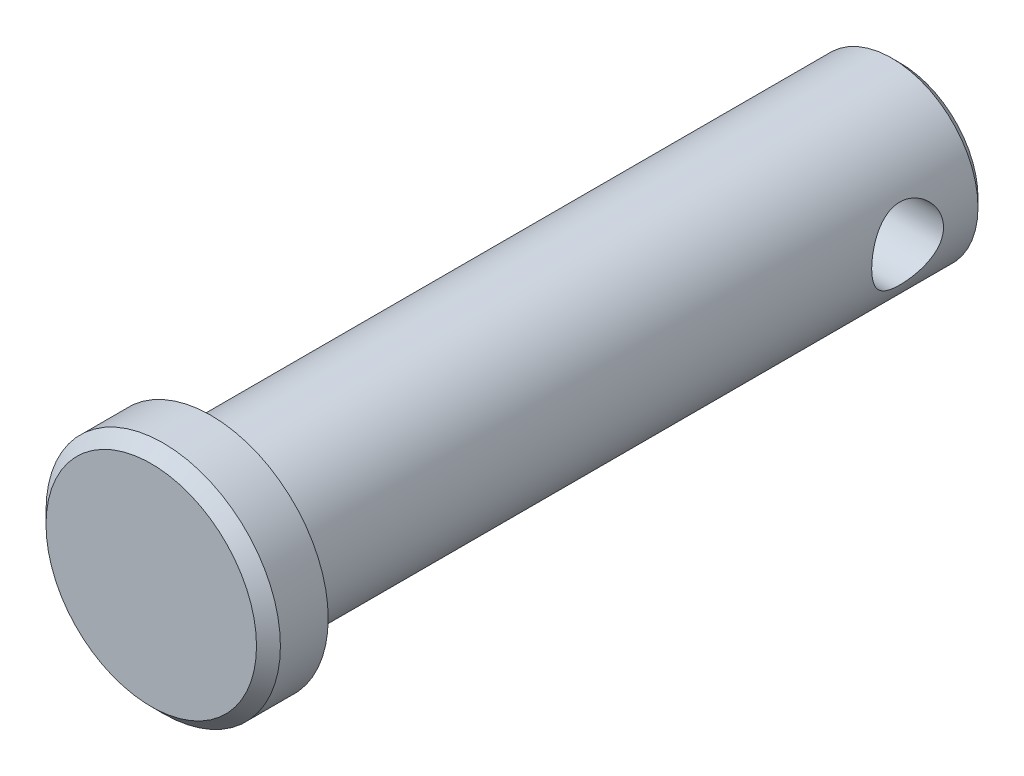
ISO-10303-21;
HEADER;
FILE_DESCRIPTION(('STEP AP214'),'2;1');
FILE_NAME('part.step','',(''),(''),'','','');
FILE_SCHEMA(('AUTOMOTIVE_DESIGN { 1 0 10303 214 1 1 1 1 }'));
ENDSEC;
DATA;
#1=APPLICATION_CONTEXT('core data for automotive mechanical design processes');
#2=APPLICATION_PROTOCOL_DEFINITION('international standard','automotive_design',2000,#1);
#3=PRODUCT_CONTEXT('',#1,'mechanical');
#4=PRODUCT('Part','Part','',(#3));
#5=PRODUCT_RELATED_PRODUCT_CATEGORY('part','',(#4));
#6=PRODUCT_DEFINITION_FORMATION('','',#4);
#7=PRODUCT_DEFINITION_CONTEXT('part definition',#1,'design');
#8=PRODUCT_DEFINITION('design','',#6,#7);
#9=PRODUCT_DEFINITION_SHAPE('','',#8);
#10=(LENGTH_UNIT() NAMED_UNIT(*) SI_UNIT(.MILLI.,.METRE.));
#11=(NAMED_UNIT(*) PLANE_ANGLE_UNIT() SI_UNIT($,.RADIAN.));
#12=(NAMED_UNIT(*) SI_UNIT($,.STERADIAN.) SOLID_ANGLE_UNIT());
#13=UNCERTAINTY_MEASURE_WITH_UNIT(LENGTH_MEASURE(1.E-05),#10,'distance_accuracy_value','');
#14=(GEOMETRIC_REPRESENTATION_CONTEXT(3) GLOBAL_UNCERTAINTY_ASSIGNED_CONTEXT((#13)) GLOBAL_UNIT_ASSIGNED_CONTEXT((#10,
#11,#12)) REPRESENTATION_CONTEXT('',''));
#15=CARTESIAN_POINT('',(0.,0.,0.));
#16=DIRECTION('',(0.,0.,1.));
#17=DIRECTION('',(1.,0.,0.));
#18=AXIS2_PLACEMENT_3D('',#15,#16,#17);
#19=CARTESIAN_POINT('',(0.,0.,19.05));
#20=DIRECTION('',(0.,0.,-1.));
#21=DIRECTION('',(-1.,0.,0.));
#22=AXIS2_PLACEMENT_3D('',#19,#20,#21);
#23=CYLINDRICAL_SURFACE('',#22,4.7625);
#24=CARTESIAN_POINT('',(0.,0.,-18.57375));
#25=DIRECTION('',(0.,0.,1.));
#26=DIRECTION('',(1.,0.,0.));
#27=AXIS2_PLACEMENT_3D('',#24,#25,#26);
#28=CIRCLE('',#27,4.7625);
#29=CARTESIAN_POINT('',(4.7625,0.,-18.57375));
#30=VERTEX_POINT('',#29);
#31=EDGE_CURVE('E41',#30,#30,#28,.T.);
#32=ORIENTED_EDGE('',*,*,#31,.T.);
#33=EDGE_LOOP('',(#32));
#34=FACE_BOUND('',#33,.T.);
#35=CARTESIAN_POINT('',(-4.7625,0.,-12.7));
#36=CARTESIAN_POINT('',(-4.76249140158045,-0.106295908560072,-12.7000114380824));
#37=CARTESIAN_POINT('',(-4.75890007347352,-0.212758967838845,-12.7085914841634));
#38=CARTESIAN_POINT('',(-4.74488118807538,-0.422667701710698,-12.7426070155608));
#39=CARTESIAN_POINT('',(-4.73443579242881,-0.526104765072406,-12.768086485087));
#40=CARTESIAN_POINT('',(-4.70783108848027,-0.726580864674275,-12.8347963582017));
#41=CARTESIAN_POINT('',(-4.69169114960318,-0.8236402825267,-12.8759734057807));
#42=CARTESIAN_POINT('',(-4.65526892272179,-1.00937973872918,-12.9726893568817));
#43=CARTESIAN_POINT('',(-4.63498788984898,-1.0980623041503,-13.0282239101163));
#44=CARTESIAN_POINT('',(-4.59117427508592,-1.26912434065072,-13.155023509863));
#45=CARTESIAN_POINT('',(-4.56753520905172,-1.35102801218445,-13.2268933277037));
#46=CARTESIAN_POINT('',(-4.52013183583765,-1.50202871598238,-13.3830446314673));
#47=CARTESIAN_POINT('',(-4.4963674694456,-1.57111900525552,-13.46733261077));
#48=CARTESIAN_POINT('',(-4.4500962212813,-1.69789058594091,-13.6509550093843));
#49=CARTESIAN_POINT('',(-4.42770874161498,-1.75484326694356,-13.7508256993771));
#50=CARTESIAN_POINT('',(-4.38841471116746,-1.85092880684824,-13.9597975469495));
#51=CARTESIAN_POINT('',(-4.37150533813807,-1.89007084577611,-14.0688939149316));
#52=CARTESIAN_POINT('',(-4.34623456677981,-1.94745924820552,-14.2877439856816));
#53=CARTESIAN_POINT('',(-4.33750065397212,-1.96662131880699,-14.397212892385));
#54=CARTESIAN_POINT('',(-4.32849855373462,-1.98636270823876,-14.6181338521399));
#55=CARTESIAN_POINT('',(-4.328225697501,-1.98695227536355,-14.7295847775409));
#56=CARTESIAN_POINT('',(-4.33586127302854,-1.97022164952332,-14.9421850959405));
#57=CARTESIAN_POINT('',(-4.34314413823751,-1.95427093765777,-15.0434692407961));
#58=CARTESIAN_POINT('',(-4.36401341403402,-1.90720965737545,-15.2417654444631));
#59=CARTESIAN_POINT('',(-4.37760103179407,-1.87609618568393,-15.3387766812432));
#60=CARTESIAN_POINT('',(-4.40985568326751,-1.79898609480019,-15.5282228534989));
#61=CARTESIAN_POINT('',(-4.42862465094254,-1.75268686068537,-15.6205164807));
#62=CARTESIAN_POINT('',(-4.46910350686474,-1.64673347596642,-15.7963834025347));
#63=CARTESIAN_POINT('',(-4.49081455356025,-1.58707405869977,-15.879953239099));
#64=CARTESIAN_POINT('',(-4.53696350793792,-1.45017484530084,-16.0434336844884));
#65=CARTESIAN_POINT('',(-4.561476802296,-1.37187540459195,-16.1224381757244));
#66=CARTESIAN_POINT('',(-4.6089200606614,-1.20289572579427,-16.2664989359477));
#67=CARTESIAN_POINT('',(-4.63184965292253,-1.11221259562442,-16.3315519375613));
#68=CARTESIAN_POINT('',(-4.67420775145901,-0.918286118550734,-16.4471918699908));
#69=CARTESIAN_POINT('',(-4.69354323137542,-0.814801174635692,-16.4974102441767));
#70=CARTESIAN_POINT('',(-4.72582051746,-0.599840689011346,-16.5794073091202));
#71=CARTESIAN_POINT('',(-4.73876585655208,-0.488369601737119,-16.6111961907108));
#72=CARTESIAN_POINT('',(-4.75614430383386,-0.268173379937138,-16.653535387501));
#73=CARTESIAN_POINT('',(-4.76106396412311,-0.159720415379841,-16.6653017236919));
#74=CARTESIAN_POINT('',(-4.76338979960382,0.0577130156000396,-16.6708871299874));
#75=CARTESIAN_POINT('',(-4.76079813192703,0.166693321604807,-16.664711352775));
#76=CARTESIAN_POINT('',(-4.74870808030392,0.376393459717026,-16.6354584028704));
#77=CARTESIAN_POINT('',(-4.73955883563333,0.477254834540024,-16.6132351978707));
#78=CARTESIAN_POINT('',(-4.71564663251208,0.673707613991605,-16.5537067411665));
#79=CARTESIAN_POINT('',(-4.7008829648603,0.769298351097896,-16.5163995840539));
#80=CARTESIAN_POINT('',(-4.666587546492,0.955848037292252,-16.426543576057));
#81=CARTESIAN_POINT('',(-4.64692192707484,1.04657086350783,-16.3735572592557));
#82=CARTESIAN_POINT('',(-4.60492164769306,1.21816211826739,-16.2543277627557));
#83=CARTESIAN_POINT('',(-4.58258587495364,1.29902640975558,-16.1880790481973));
#84=CARTESIAN_POINT('',(-4.53567939534007,1.45467932056039,-16.03866611718));
#85=CARTESIAN_POINT('',(-4.51106304400759,1.52862073304299,-15.9546313765093));
#86=CARTESIAN_POINT('',(-4.46380134619208,1.66158838069249,-15.7749537244526));
#87=CARTESIAN_POINT('',(-4.44115644808334,1.72061122865917,-15.6793081841649));
#88=CARTESIAN_POINT('',(-4.40025450662331,1.8227033683131,-15.4771499967072));
#89=CARTESIAN_POINT('',(-4.3820645555624,1.86553345201759,-15.3705019686202));
#90=CARTESIAN_POINT('',(-4.35305764608595,1.93226394648122,-15.1505116823265));
#91=CARTESIAN_POINT('',(-4.34223460919757,1.95617996596104,-15.0371750270577));
#92=CARTESIAN_POINT('',(-4.33011523702907,1.98285227553879,-14.8164253150213));
#93=CARTESIAN_POINT('',(-4.32814969660371,1.98709566405842,-14.7092278486105));
#94=CARTESIAN_POINT('',(-4.33218991655001,1.9782722614421,-14.4957119579385));
#95=CARTESIAN_POINT('',(-4.33819445320237,1.96520812768995,-14.389393401252));
#96=CARTESIAN_POINT('',(-4.3568866269235,1.92338967589029,-14.1857527633931));
#97=CARTESIAN_POINT('',(-4.36925013318788,1.89539409419702,-14.0882422808769));
#98=CARTESIAN_POINT('',(-4.39901300153713,1.82524921020888,-13.8992800160954));
#99=CARTESIAN_POINT('',(-4.41641377846563,1.78309593083637,-13.8078299449294));
#100=CARTESIAN_POINT('',(-4.45558790364021,1.68291328922589,-13.6275827651808));
#101=CARTESIAN_POINT('',(-4.47756125557966,1.62408172945392,-13.5392758008578));
#102=CARTESIAN_POINT('',(-4.5228460637297,1.49333596530074,-13.3733220287649));
#103=CARTESIAN_POINT('',(-4.54615798199076,1.42141722463767,-13.2956789337341));
#104=CARTESIAN_POINT('',(-4.59353273649544,1.26031949767388,-13.1474389678255));
#105=CARTESIAN_POINT('',(-4.61752660299969,1.17026489966908,-13.0777671628655));
#106=CARTESIAN_POINT('',(-4.66185477999957,0.97885262581445,-12.9544771174995));
#107=CARTESIAN_POINT('',(-4.68218742117825,0.877489827988868,-12.9008661926128));
#108=CARTESIAN_POINT('',(-4.71660828587906,0.667912140039744,-12.8123793703642));
#109=CARTESIAN_POINT('',(-4.73079417348867,0.559838210681758,-12.777208432995));
#110=CARTESIAN_POINT('',(-4.75172103007692,0.338789044681411,-12.7258662025889));
#111=CARTESIAN_POINT('',(-4.75848530476497,0.225830315707269,-12.7096354224838));
#112=CARTESIAN_POINT('',(-4.76206006515682,0.0749872800467031,-12.7010586067753));
#113=CARTESIAN_POINT('',(-4.76250303375275,0.0375040440476054,-12.6999959643381));
#114=CARTESIAN_POINT('',(-4.7625,0.,-12.7));
#115=B_SPLINE_CURVE_WITH_KNOTS('',3,(#35,#36,#37,#38,#39,#40,#41,#42,#43,#44,#45,#46,#47,#48,
#49,#50,#51,#52,#53,#54,#55,#56,#57,#58,#59,#60,#61,#62,#63,#64,#65,#66,#67,#68,#69,#70,#71,#72,
#73,#74,#75,#76,#77,#78,#79,#80,#81,#82,#83,#84,#85,#86,#87,#88,#89,#90,#91,#92,#93,#94,#95,#96,
#97,#98,#99,#100,#101,#102,#103,#104,#105,#106,#107,#108,#109,#110,#111,#112,#113,#114),
.UNSPECIFIED.,.T.,.F.,(4,2,2,2,2,2,2,2,2,2,2,2,2,2,2,2,2,2,2,2,2,2,2,2,2,2,2,2,2,2,2,2,2,2,2,2,
2,2,2,4),(0.,0.31878098372825,0.638394933248055,0.956932064901252,1.27537279350409,
1.60842223858481,1.94164645533701,2.29126612705861,2.64070539184808,2.97331246105872,
3.3057359947036,3.61267624559058,3.91967529066949,4.23320706980709,4.54686266326064,
4.88702574040535,5.22726839536908,5.5753643740904,5.92326768446545,6.24916903886785,
6.57497680895409,6.88461586205456,7.19429404105333,7.51359202244554,7.83302353682823,
8.17528349746503,8.5176210971904,8.86483476520742,9.21176159730895,9.53198305625932,
9.85215535434837,10.1574226931906,10.462775857341,10.7864893076844,11.1103151781368,
11.4577262432026,11.8052953096787,12.1471190861327,12.4878663512005,12.6003408219232),.UNSPECIFIED.);
#116=CARTESIAN_POINT('',(-4.7625,0.,-12.7));
#117=VERTEX_POINT('',#116);
#118=EDGE_CURVE('E55',#117,#117,#115,.T.);
#119=ORIENTED_EDGE('',*,*,#118,.T.);
#120=EDGE_LOOP('',(#119));
#121=FACE_BOUND('',#120,.T.);
#122=CARTESIAN_POINT('',(4.7625,0.,-16.66875));
#123=CARTESIAN_POINT('',(4.76249140158046,-0.106295908560073,-16.6687385619176));
#124=CARTESIAN_POINT('',(4.75890007347352,-0.212758967838847,-16.6601585158366));
#125=CARTESIAN_POINT('',(4.74488118807538,-0.4226677017107,-16.6261429844392));
#126=CARTESIAN_POINT('',(4.73443579242881,-0.526104765072408,-16.600663514913));
#127=CARTESIAN_POINT('',(4.70783108848027,-0.726580864674275,-16.5339536417983));
#128=CARTESIAN_POINT('',(4.69169114960318,-0.823640282526699,-16.4927765942193));
#129=CARTESIAN_POINT('',(4.65526892272179,-1.00937973872918,-16.3960606431183));
#130=CARTESIAN_POINT('',(4.63498788984898,-1.0980623041503,-16.3405260898837));
#131=CARTESIAN_POINT('',(4.59117427508592,-1.26912434065072,-16.213726490137));
#132=CARTESIAN_POINT('',(4.56753520905172,-1.35102801218446,-16.1418566722963));
#133=CARTESIAN_POINT('',(4.52013183583765,-1.50202871598238,-15.9857053685327));
#134=CARTESIAN_POINT('',(4.4963674694456,-1.57111900525552,-15.90141738923));
#135=CARTESIAN_POINT('',(4.4500962212813,-1.69789058594091,-15.7177949906157));
#136=CARTESIAN_POINT('',(4.42770874161498,-1.75484326694356,-15.6179243006229));
#137=CARTESIAN_POINT('',(4.38841471116746,-1.85092880684824,-15.4089524530505));
#138=CARTESIAN_POINT('',(4.37150533813807,-1.89007084577611,-15.2998560850684));
#139=CARTESIAN_POINT('',(4.34623456677981,-1.94745924820552,-15.0810060143184));
#140=CARTESIAN_POINT('',(4.33750065397212,-1.96662131880699,-14.971537107615));
#141=CARTESIAN_POINT('',(4.32849855373462,-1.98636270823876,-14.7506161478601));
#142=CARTESIAN_POINT('',(4.328225697501,-1.98695227536355,-14.6391652224591));
#143=CARTESIAN_POINT('',(4.33586127302854,-1.97022164952332,-14.4265649040595));
#144=CARTESIAN_POINT('',(4.34314413823751,-1.95427093765777,-14.3252807592039));
#145=CARTESIAN_POINT('',(4.36401341403402,-1.90720965737545,-14.1269845555369));
#146=CARTESIAN_POINT('',(4.37760103179407,-1.87609618568393,-14.0299733187568));
#147=CARTESIAN_POINT('',(4.40985568326751,-1.79898609480019,-13.8405271465011));
#148=CARTESIAN_POINT('',(4.42862465094254,-1.75268686068537,-13.7482335193));
#149=CARTESIAN_POINT('',(4.46910350686474,-1.64673347596643,-13.5723665974653));
#150=CARTESIAN_POINT('',(4.49081455356025,-1.58707405869977,-13.488796760901));
#151=CARTESIAN_POINT('',(4.53696350793792,-1.45017484530084,-13.3253163155116));
#152=CARTESIAN_POINT('',(4.561476802296,-1.37187540459195,-13.2463118242756));
#153=CARTESIAN_POINT('',(4.6089200606614,-1.20289572579427,-13.1022510640523));
#154=CARTESIAN_POINT('',(4.63184965292253,-1.11221259562442,-13.0371980624387));
#155=CARTESIAN_POINT('',(4.67420775145901,-0.918286118550734,-12.9215581300092));
#156=CARTESIAN_POINT('',(4.69354323137542,-0.814801174635692,-12.8713397558233));
#157=CARTESIAN_POINT('',(4.72582051746,-0.599840689011345,-12.7893426908798));
#158=CARTESIAN_POINT('',(4.73876585655208,-0.488369601737118,-12.7575538092892));
#159=CARTESIAN_POINT('',(4.75614430383386,-0.268173379937137,-12.715214612499));
#160=CARTESIAN_POINT('',(4.76106396412311,-0.15972041537984,-12.7034482763081));
#161=CARTESIAN_POINT('',(4.76338979960382,0.0577130156000403,-12.6978628700126));
#162=CARTESIAN_POINT('',(4.76079813192703,0.166693321604808,-12.704038647225));
#163=CARTESIAN_POINT('',(4.74870808030392,0.376393459717027,-12.7332915971296));
#164=CARTESIAN_POINT('',(4.73955883563333,0.477254834540025,-12.7555148021293));
#165=CARTESIAN_POINT('',(4.71564663251208,0.673707613991605,-12.8150432588335));
#166=CARTESIAN_POINT('',(4.70088296486029,0.769298351097896,-12.8523504159461));
#167=CARTESIAN_POINT('',(4.666587546492,0.955848037292252,-12.942206423943));
#168=CARTESIAN_POINT('',(4.64692192707484,1.04657086350782,-12.9951927407443));
#169=CARTESIAN_POINT('',(4.60492164769306,1.21816211826739,-13.1144222372443));
#170=CARTESIAN_POINT('',(4.58258587495364,1.29902640975558,-13.1806709518027));
#171=CARTESIAN_POINT('',(4.53567939534007,1.45467932056039,-13.3300838828199));
#172=CARTESIAN_POINT('',(4.51106304400759,1.52862073304299,-13.4141186234907));
#173=CARTESIAN_POINT('',(4.46380134619208,1.66158838069249,-13.5937962755474));
#174=CARTESIAN_POINT('',(4.44115644808334,1.72061122865917,-13.6894418158351));
#175=CARTESIAN_POINT('',(4.40025450662331,1.8227033683131,-13.8916000032928));
#176=CARTESIAN_POINT('',(4.3820645555624,1.86553345201759,-13.9982480313798));
#177=CARTESIAN_POINT('',(4.35305764608594,1.93226394648122,-14.2182383176735));
#178=CARTESIAN_POINT('',(4.34223460919756,1.95617996596104,-14.3315749729423));
#179=CARTESIAN_POINT('',(4.33011523702907,1.98285227553879,-14.5523246849787));
#180=CARTESIAN_POINT('',(4.32814969660371,1.98709566405842,-14.6595221513895));
#181=CARTESIAN_POINT('',(4.33218991655001,1.9782722614421,-14.8730380420615));
#182=CARTESIAN_POINT('',(4.33819445320237,1.96520812768995,-14.979356598748));
#183=CARTESIAN_POINT('',(4.3568866269235,1.92338967589029,-15.1829972366069));
#184=CARTESIAN_POINT('',(4.36925013318788,1.89539409419702,-15.2805077191231));
#185=CARTESIAN_POINT('',(4.39901300153713,1.82524921020888,-15.4694699839046));
#186=CARTESIAN_POINT('',(4.41641377846563,1.78309593083637,-15.5609200550706));
#187=CARTESIAN_POINT('',(4.45558790364021,1.68291328922589,-15.7411672348192));
#188=CARTESIAN_POINT('',(4.47756125557966,1.62408172945392,-15.8294741991422));
#189=CARTESIAN_POINT('',(4.5228460637297,1.49333596530074,-15.9954279712351));
#190=CARTESIAN_POINT('',(4.54615798199076,1.42141722463767,-16.0730710662659));
#191=CARTESIAN_POINT('',(4.59353273649544,1.26031949767387,-16.2213110321745));
#192=CARTESIAN_POINT('',(4.61752660299969,1.17026489966908,-16.2909828371345));
#193=CARTESIAN_POINT('',(4.66185477999957,0.978852625814449,-16.4142728825005));
#194=CARTESIAN_POINT('',(4.68218742117825,0.877489827988868,-16.4678838073872));
#195=CARTESIAN_POINT('',(4.71660828587906,0.667912140039744,-16.5563706296358));
#196=CARTESIAN_POINT('',(4.73079417348868,0.559838210681757,-16.591541567005));
#197=CARTESIAN_POINT('',(4.75172103007692,0.33878904468141,-16.6428837974111));
#198=CARTESIAN_POINT('',(4.75848530476497,0.225830315707268,-16.6591145775162));
#199=CARTESIAN_POINT('',(4.76206006515682,0.0749872800467027,-16.6676913932247));
#200=CARTESIAN_POINT('',(4.76250303375276,0.0375040440476052,-16.6687540356619));
#201=CARTESIAN_POINT('',(4.7625,0.,-16.66875));
#202=B_SPLINE_CURVE_WITH_KNOTS('',3,(#122,#123,#124,#125,#126,#127,#128,#129,#130,#131,#132,
#133,#134,#135,#136,#137,#138,#139,#140,#141,#142,#143,#144,#145,#146,#147,#148,#149,#150,#151,
#152,#153,#154,#155,#156,#157,#158,#159,#160,#161,#162,#163,#164,#165,#166,#167,#168,#169,#170,
#171,#172,#173,#174,#175,#176,#177,#178,#179,#180,#181,#182,#183,#184,#185,#186,#187,#188,#189,
#190,#191,#192,#193,#194,#195,#196,#197,#198,#199,#200,#201),.UNSPECIFIED.,.T.,.F.,(4,2,2,2,2,2,
2,2,2,2,2,2,2,2,2,2,2,2,2,2,2,2,2,2,2,2,2,2,2,2,2,2,2,2,2,2,2,2,2,4),(0.,0.318780983728252,
0.638394933248055,0.956932064901251,1.27537279350409,1.60842223858481,1.94164645533701,
2.29126612705861,2.64070539184808,2.97331246105872,3.3057359947036,3.61267624559057,
3.91967529066949,4.23320706980708,4.54686266326064,4.88702574040535,5.22726839536907,
5.5753643740904,5.92326768446545,6.24916903886785,6.57497680895409,6.88461586205456,
7.19429404105332,7.51359202244554,7.83302353682823,8.17528349746503,8.5176210971904,
8.86483476520742,9.21176159730895,9.53198305625933,9.85215535434837,10.1574226931906,
10.462775857341,10.7864893076844,11.1103151781368,11.4577262432026,11.8052953096787,
12.1471190861327,12.4878663512005,12.6003408219232),.UNSPECIFIED.);
#203=CARTESIAN_POINT('',(4.7625,0.,-16.66875));
#204=VERTEX_POINT('',#203);
#205=EDGE_CURVE('E63',#204,#204,#202,.T.);
#206=ORIENTED_EDGE('',*,*,#205,.T.);
#207=EDGE_LOOP('',(#206));
#208=FACE_BOUND('',#207,.T.);
#209=CARTESIAN_POINT('',(0.,0.,19.05));
#210=DIRECTION('',(0.,0.,1.));
#211=DIRECTION('',(1.,0.,0.));
#212=AXIS2_PLACEMENT_3D('',#209,#210,#211);
#213=CIRCLE('',#212,4.7625);
#214=CARTESIAN_POINT('',(4.7625,0.,19.05));
#215=VERTEX_POINT('',#214);
#216=EDGE_CURVE('E101',#215,#215,#213,.T.);
#217=ORIENTED_EDGE('',*,*,#216,.F.);
#218=EDGE_LOOP('',(#217));
#219=FACE_BOUND('',#218,.T.);
#220=ADVANCED_FACE('F34',(#34,#121,#208,#219),#23,.T.);
#221=CARTESIAN_POINT('',(0.,0.,-19.05));
#222=DIRECTION('',(0.,0.,1.));
#223=DIRECTION('',(1.,0.,0.));
#224=AXIS2_PLACEMENT_3D('',#221,#222,#223);
#225=PLANE('',#224);
#226=CARTESIAN_POINT('',(0.,0.,-19.05));
#227=DIRECTION('',(0.,0.,1.));
#228=DIRECTION('',(1.,0.,0.));
#229=AXIS2_PLACEMENT_3D('',#226,#227,#228);
#230=CIRCLE('',#229,4.28624999999996);
#231=CARTESIAN_POINT('',(4.28624999999996,0.,-19.05));
#232=VERTEX_POINT('',#231);
#233=EDGE_CURVE('E10',#232,#232,#230,.F.);
#234=ORIENTED_EDGE('',*,*,#233,.T.);
#235=EDGE_LOOP('',(#234));
#236=FACE_BOUND('',#235,.T.);
#237=ADVANCED_FACE('F83',(#236),#225,.F.);
#238=CARTESIAN_POINT('',(0.,0.,19.05));
#239=DIRECTION('',(0.,0.,1.));
#240=DIRECTION('',(1.,0.,0.));
#241=AXIS2_PLACEMENT_3D('',#238,#239,#240);
#242=PLANE('',#241);
#243=CARTESIAN_POINT('',(0.,0.,19.05));
#244=DIRECTION('',(0.,0.,1.));
#245=DIRECTION('',(1.,0.,0.));
#246=AXIS2_PLACEMENT_3D('',#243,#244,#245);
#247=CIRCLE('',#246,6.477);
#248=CARTESIAN_POINT('',(-6.477,0.,19.05));
#249=VERTEX_POINT('',#248);
#250=EDGE_CURVE('E62',#249,#249,#247,.T.);
#251=ORIENTED_EDGE('',*,*,#250,.F.);
#252=EDGE_LOOP('',(#251));
#253=FACE_BOUND('',#252,.T.);
#254=ORIENTED_EDGE('',*,*,#216,.T.);
#255=EDGE_LOOP('',(#254));
#256=FACE_BOUND('',#255,.T.);
#257=ADVANCED_FACE('F80',(#253,#256),#242,.F.);
#258=CARTESIAN_POINT('',(0.,0.,22.352));
#259=DIRECTION('',(0.,0.,-1.));
#260=DIRECTION('',(-1.,0.,0.));
#261=AXIS2_PLACEMENT_3D('',#258,#259,#260);
#262=CYLINDRICAL_SURFACE('',#261,6.477);
#263=CARTESIAN_POINT('',(0.,0.,21.6916));
#264=DIRECTION('',(0.,0.,1.));
#265=DIRECTION('',(1.,0.,0.));
#266=AXIS2_PLACEMENT_3D('',#263,#264,#265);
#267=CIRCLE('',#266,6.477);
#268=CARTESIAN_POINT('',(-6.477,0.,21.6916));
#269=VERTEX_POINT('',#268);
#270=EDGE_CURVE('E46',#269,#269,#267,.F.);
#271=CARTESIAN_POINT('',(-6.477,0.,21.6916));
#272=CARTESIAN_POINT('',(-6.477,0.,21.6640833333334));
#273=CARTESIAN_POINT('',(-6.477,0.,21.6365666666667));
#274=CARTESIAN_POINT('',(-6.477,0.,21.5815333333334));
#275=CARTESIAN_POINT('',(-6.477,0.,21.5540166666667));
#276=CARTESIAN_POINT('',(-6.477,0.,21.4989833333334));
#277=CARTESIAN_POINT('',(-6.477,0.,21.4714666666667));
#278=CARTESIAN_POINT('',(-6.477,0.,21.4164333333334));
#279=CARTESIAN_POINT('',(-6.477,0.,21.3889166666667));
#280=CARTESIAN_POINT('',(-6.477,0.,21.3338833333334));
#281=CARTESIAN_POINT('',(-6.477,0.,21.3063666666667));
#282=CARTESIAN_POINT('',(-6.477,0.,21.2513333333334));
#283=CARTESIAN_POINT('',(-6.477,0.,21.2238166666667));
#284=CARTESIAN_POINT('',(-6.477,0.,21.1687833333334));
#285=CARTESIAN_POINT('',(-6.477,0.,21.1412666666667));
#286=CARTESIAN_POINT('',(-6.477,0.,21.0862333333334));
#287=CARTESIAN_POINT('',(-6.477,0.,21.0587166666667));
#288=CARTESIAN_POINT('',(-6.477,0.,21.0036833333333));
#289=CARTESIAN_POINT('',(-6.477,0.,20.9761666666667));
#290=CARTESIAN_POINT('',(-6.477,0.,20.9211333333333));
#291=CARTESIAN_POINT('',(-6.477,0.,20.8936166666667));
#292=CARTESIAN_POINT('',(-6.477,0.,20.8385833333333));
#293=CARTESIAN_POINT('',(-6.477,0.,20.8110666666667));
#294=CARTESIAN_POINT('',(-6.477,0.,20.7560333333333));
#295=CARTESIAN_POINT('',(-6.477,0.,20.7285166666667));
#296=CARTESIAN_POINT('',(-6.477,0.,20.6734833333333));
#297=CARTESIAN_POINT('',(-6.477,0.,20.6459666666667));
#298=CARTESIAN_POINT('',(-6.477,0.,20.5909333333333));
#299=CARTESIAN_POINT('',(-6.477,0.,20.5634166666667));
#300=CARTESIAN_POINT('',(-6.477,0.,20.5083833333333));
#301=CARTESIAN_POINT('',(-6.477,0.,20.4808666666667));
#302=CARTESIAN_POINT('',(-6.477,0.,20.4258333333333));
#303=CARTESIAN_POINT('',(-6.477,0.,20.3983166666667));
#304=CARTESIAN_POINT('',(-6.477,0.,20.3432833333333));
#305=CARTESIAN_POINT('',(-6.477,0.,20.3157666666667));
#306=CARTESIAN_POINT('',(-6.477,0.,20.2607333333333));
#307=CARTESIAN_POINT('',(-6.477,0.,20.2332166666667));
#308=CARTESIAN_POINT('',(-6.477,0.,20.1781833333333));
#309=CARTESIAN_POINT('',(-6.477,0.,20.1506666666667));
#310=CARTESIAN_POINT('',(-6.477,0.,20.0956333333333));
#311=CARTESIAN_POINT('',(-6.477,0.,20.0681166666667));
#312=CARTESIAN_POINT('',(-6.477,0.,20.0130833333333));
#313=CARTESIAN_POINT('',(-6.477,0.,19.9855666666667));
#314=CARTESIAN_POINT('',(-6.477,0.,19.9305333333333));
#315=CARTESIAN_POINT('',(-6.477,0.,19.9030166666667));
#316=CARTESIAN_POINT('',(-6.477,0.,19.8479833333333));
#317=CARTESIAN_POINT('',(-6.477,0.,19.8204666666667));
#318=CARTESIAN_POINT('',(-6.477,0.,19.7654333333333));
#319=CARTESIAN_POINT('',(-6.477,0.,19.7379166666667));
#320=CARTESIAN_POINT('',(-6.477,0.,19.6828833333333));
#321=CARTESIAN_POINT('',(-6.477,0.,19.6553666666667));
#322=CARTESIAN_POINT('',(-6.477,0.,19.6003333333333));
#323=CARTESIAN_POINT('',(-6.477,0.,19.5728166666667));
#324=CARTESIAN_POINT('',(-6.477,0.,19.5177833333333));
#325=CARTESIAN_POINT('',(-6.477,0.,19.4902666666667));
#326=CARTESIAN_POINT('',(-6.477,0.,19.4352333333333));
#327=CARTESIAN_POINT('',(-6.477,0.,19.4077166666667));
#328=CARTESIAN_POINT('',(-6.477,0.,19.3526833333333));
#329=CARTESIAN_POINT('',(-6.477,0.,19.3251666666667));
#330=CARTESIAN_POINT('',(-6.477,0.,19.2701333333333));
#331=CARTESIAN_POINT('',(-6.477,0.,19.2426166666667));
#332=CARTESIAN_POINT('',(-6.477,0.,19.1875833333333));
#333=CARTESIAN_POINT('',(-6.477,0.,19.1600666666667));
#334=CARTESIAN_POINT('',(-6.477,0.,19.1050333333333));
#335=CARTESIAN_POINT('',(-6.477,0.,19.0775166666667));
#336=CARTESIAN_POINT('',(-6.477,0.,19.05));
#337=B_SPLINE_CURVE_WITH_KNOTS('',3,(#271,#272,#273,#274,#275,#276,#277,#278,#279,#280,#281,
#282,#283,#284,#285,#286,#287,#288,#289,#290,#291,#292,#293,#294,#295,#296,#297,#298,#299,#300,
#301,#302,#303,#304,#305,#306,#307,#308,#309,#310,#311,#312,#313,#314,#315,#316,#317,#318,#319,
#320,#321,#322,#323,#324,#325,#326,#327,#328,#329,#330,#331,#332,#333,#334,#335,#336),
.UNSPECIFIED.,.F.,.F.,(4,2,2,2,2,2,2,2,2,2,2,2,2,2,2,2,2,2,2,2,2,2,2,2,2,2,2,2,2,2,2,2,4),(0.,
0.0825500000000007,0.165100000000001,0.247650000000002,0.330200000000003,0.412750000000003,
0.495300000000004,0.577850000000005,0.660400000000005,0.742950000000006,0.825500000000007,
0.908050000000007,0.990600000000008,1.07315000000001,1.15570000000001,1.23825000000001,
1.32080000000001,1.40335000000001,1.48590000000001,1.56845000000001,1.65100000000001,
1.73355000000001,1.81610000000001,1.89865000000002,1.98120000000002,2.06375000000002,
2.14630000000002,2.22885000000002,2.31140000000002,2.39395000000002,2.47650000000002,
2.55905000000002,2.64160000000002),.UNSPECIFIED.);
#338=EDGE_CURVE('BSEAM78',#269,#249,#337,.T.);
#339=ORIENTED_EDGE('',*,*,#270,.T.);
#340=ORIENTED_EDGE('',*,*,#250,.T.);
#341=ORIENTED_EDGE('',*,*,#338,.T.);
#342=ORIENTED_EDGE('',*,*,#338,.F.);
#343=EDGE_LOOP('',(#339,#341,#340,#342));
#344=FACE_BOUND('',#343,.T.);
#345=ADVANCED_FACE('F78',(#344),#262,.T.);
#346=CARTESIAN_POINT('',(0.,0.,22.352));
#347=DIRECTION('',(0.,0.,1.));
#348=DIRECTION('',(1.,0.,0.));
#349=AXIS2_PLACEMENT_3D('',#346,#347,#348);
#350=PLANE('',#349);
#351=CARTESIAN_POINT('',(0.,0.,22.352));
#352=DIRECTION('',(0.,0.,1.));
#353=DIRECTION('',(1.,0.,0.));
#354=AXIS2_PLACEMENT_3D('',#351,#352,#353);
#355=CIRCLE('',#354,5.81660000000003);
#356=CARTESIAN_POINT('',(5.81660000000003,0.,22.352));
#357=VERTEX_POINT('',#356);
#358=EDGE_CURVE('E52',#357,#357,#355,.T.);
#359=ORIENTED_EDGE('',*,*,#358,.T.);
#360=EDGE_LOOP('',(#359));
#361=FACE_BOUND('',#360,.T.);
#362=ADVANCED_FACE('F74',(#361),#350,.T.);
#363=CARTESIAN_POINT('',(0.,0.,22.352));
#364=DIRECTION('',(0.,0.,-1.));
#365=DIRECTION('',(-1.,0.,0.));
#366=AXIS2_PLACEMENT_3D('',#363,#364,#365);
#367=CONICAL_SURFACE('',#366,5.81660000000003,0.785398163397444);
#368=ORIENTED_EDGE('',*,*,#270,.F.);
#369=EDGE_LOOP('',(#368));
#370=FACE_BOUND('',#369,.T.);
#371=ORIENTED_EDGE('',*,*,#358,.F.);
#372=EDGE_LOOP('',(#371));
#373=FACE_BOUND('',#372,.T.);
#374=ADVANCED_FACE('F72',(#370,#373),#367,.T.);
#375=CARTESIAN_POINT('',(-6.477,0.,-14.684375));
#376=DIRECTION('',(1.,0.,0.));
#377=DIRECTION('',(0.,0.,-1.));
#378=AXIS2_PLACEMENT_3D('',#375,#376,#377);
#379=CYLINDRICAL_SURFACE('',#378,1.984375);
#380=ORIENTED_EDGE('',*,*,#205,.F.);
#381=EDGE_LOOP('',(#380));
#382=FACE_BOUND('',#381,.T.);
#383=ORIENTED_EDGE('',*,*,#118,.F.);
#384=EDGE_LOOP('',(#383));
#385=FACE_BOUND('',#384,.T.);
#386=ADVANCED_FACE('F68',(#382,#385),#379,.F.);
#387=CARTESIAN_POINT('',(0.,0.,-18.57375));
#388=DIRECTION('',(0.,0.,1.));
#389=DIRECTION('',(1.,0.,0.));
#390=AXIS2_PLACEMENT_3D('',#387,#388,#389);
#391=CONICAL_SURFACE('',#390,4.7625,0.785398163397443);
#392=ORIENTED_EDGE('',*,*,#233,.F.);
#393=EDGE_LOOP('',(#392));
#394=FACE_BOUND('',#393,.T.);
#395=ORIENTED_EDGE('',*,*,#31,.F.);
#396=EDGE_LOOP('',(#395));
#397=FACE_BOUND('',#396,.T.);
#398=ADVANCED_FACE('F36',(#394,#397),#391,.T.);
#399=CLOSED_SHELL('',(#220,#237,#257,#345,#362,#374,#386,#398));
#400=MANIFOLD_SOLID_BREP('B2',#399);
#401=ADVANCED_BREP_SHAPE_REPRESENTATION('',(#18,#400),#14);
#402=SHAPE_DEFINITION_REPRESENTATION(#9,#401);
ENDSEC;
END-ISO-10303-21;
